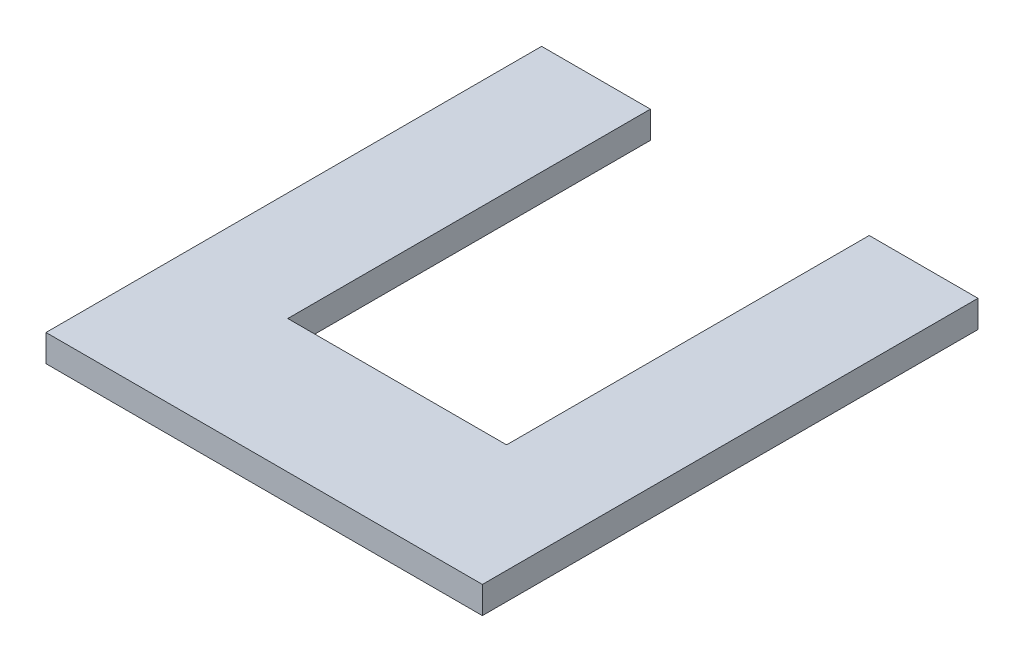
ISO-10303-21;
HEADER;
FILE_DESCRIPTION(('STEP AP214'),'2;1');
FILE_NAME('part.step','',(''),(''),'','','');
FILE_SCHEMA(('AUTOMOTIVE_DESIGN { 1 0 10303 214 1 1 1 1 }'));
ENDSEC;
DATA;
#1=APPLICATION_CONTEXT('core data for automotive mechanical design processes');
#2=APPLICATION_PROTOCOL_DEFINITION('international standard','automotive_design',2000,#1);
#3=PRODUCT_CONTEXT('',#1,'mechanical');
#4=PRODUCT('Part','Part','',(#3));
#5=PRODUCT_RELATED_PRODUCT_CATEGORY('part','',(#4));
#6=PRODUCT_DEFINITION_FORMATION('','',#4);
#7=PRODUCT_DEFINITION_CONTEXT('part definition',#1,'design');
#8=PRODUCT_DEFINITION('design','',#6,#7);
#9=PRODUCT_DEFINITION_SHAPE('','',#8);
#10=(LENGTH_UNIT() NAMED_UNIT(*) SI_UNIT(.MILLI.,.METRE.));
#11=(NAMED_UNIT(*) PLANE_ANGLE_UNIT() SI_UNIT($,.RADIAN.));
#12=(NAMED_UNIT(*) SI_UNIT($,.STERADIAN.) SOLID_ANGLE_UNIT());
#13=UNCERTAINTY_MEASURE_WITH_UNIT(LENGTH_MEASURE(1.E-05),#10,'distance_accuracy_value','');
#14=(GEOMETRIC_REPRESENTATION_CONTEXT(3) GLOBAL_UNCERTAINTY_ASSIGNED_CONTEXT((#13)) GLOBAL_UNIT_ASSIGNED_CONTEXT((#10,
#11,#12)) REPRESENTATION_CONTEXT('',''));
#15=CARTESIAN_POINT('',(0.,0.,0.));
#16=DIRECTION('',(0.,0.,1.));
#17=DIRECTION('',(1.,0.,0.));
#18=AXIS2_PLACEMENT_3D('',#15,#16,#17);
#19=CARTESIAN_POINT('',(0.,5.,-91.567));
#20=DIRECTION('',(0.,0.,1.));
#21=DIRECTION('',(1.,0.,0.));
#22=AXIS2_PLACEMENT_3D('',#19,#20,#21);
#23=PLANE('',#22);
#24=DIRECTION('',(-1.,0.,0.));
#25=VECTOR('',#24,1.);
#26=CARTESIAN_POINT('',(0.,0.,-91.567));
#27=LINE('',#26,#25);
#28=CARTESIAN_POINT('',(80.6273389559778,0.,-91.567));
#29=VERTEX_POINT('',#28);
#30=CARTESIAN_POINT('',(60.5287668480876,0.,-91.567));
#31=VERTEX_POINT('',#30);
#32=EDGE_CURVE('E147',#29,#31,#27,.T.);
#33=ORIENTED_EDGE('',*,*,#32,.T.);
#34=DIRECTION('',(0.,-1.,0.));
#35=VECTOR('',#34,1.);
#36=CARTESIAN_POINT('',(60.5287668480876,5.,-91.567));
#37=LINE('',#36,#35);
#38=CARTESIAN_POINT('',(60.5287668480876,5.,-91.567));
#39=VERTEX_POINT('',#38);
#40=EDGE_CURVE('E11',#39,#31,#37,.T.);
#41=ORIENTED_EDGE('',*,*,#40,.F.);
#42=DIRECTION('',(-1.,0.,0.));
#43=VECTOR('',#42,1.);
#44=CARTESIAN_POINT('',(0.,5.,-91.567));
#45=LINE('',#44,#43);
#46=CARTESIAN_POINT('',(80.6273389559778,5.,-91.567));
#47=VERTEX_POINT('',#46);
#48=EDGE_CURVE('E172',#47,#39,#45,.T.);
#49=ORIENTED_EDGE('',*,*,#48,.F.);
#50=DIRECTION('',(0.,-1.,0.));
#51=VECTOR('',#50,1.);
#52=CARTESIAN_POINT('',(80.6273389559778,5.,-91.567));
#53=LINE('',#52,#51);
#54=EDGE_CURVE('E61',#47,#29,#53,.T.);
#55=ORIENTED_EDGE('',*,*,#54,.T.);
#56=EDGE_LOOP('',(#33,#41,#49,#55));
#57=FACE_BOUND('',#56,.T.);
#58=ADVANCED_FACE('F43',(#57),#23,.F.);
#59=CARTESIAN_POINT('',(60.5287668480876,5.,0.));
#60=DIRECTION('',(1.,0.,0.));
#61=DIRECTION('',(0.,0.,-1.));
#62=AXIS2_PLACEMENT_3D('',#59,#60,#61);
#63=PLANE('',#62);
#64=DIRECTION('',(0.,0.,1.));
#65=VECTOR('',#64,1.);
#66=CARTESIAN_POINT('',(60.5287668480876,0.,0.));
#67=LINE('',#66,#65);
#68=CARTESIAN_POINT('',(60.5287668480876,0.,-24.567));
#69=VERTEX_POINT('',#68);
#70=EDGE_CURVE('E150',#31,#69,#67,.T.);
#71=ORIENTED_EDGE('',*,*,#70,.T.);
#72=DIRECTION('',(0.,-1.,0.));
#73=VECTOR('',#72,1.);
#74=CARTESIAN_POINT('',(60.5287668480876,5.,-24.567));
#75=LINE('',#74,#73);
#76=CARTESIAN_POINT('',(60.5287668480876,5.,-24.567));
#77=VERTEX_POINT('',#76);
#78=EDGE_CURVE('E53',#77,#69,#75,.T.);
#79=ORIENTED_EDGE('',*,*,#78,.F.);
#80=DIRECTION('',(0.,0.,1.));
#81=VECTOR('',#80,1.);
#82=CARTESIAN_POINT('',(60.5287668480876,5.,0.));
#83=LINE('',#82,#81);
#84=EDGE_CURVE('E99',#39,#77,#83,.T.);
#85=ORIENTED_EDGE('',*,*,#84,.F.);
#86=ORIENTED_EDGE('',*,*,#40,.T.);
#87=EDGE_LOOP('',(#71,#79,#85,#86));
#88=FACE_BOUND('',#87,.T.);
#89=ADVANCED_FACE('F45',(#88),#63,.F.);
#90=CARTESIAN_POINT('',(0.,5.,-24.567));
#91=DIRECTION('',(0.,0.,-1.));
#92=DIRECTION('',(-1.,0.,0.));
#93=AXIS2_PLACEMENT_3D('',#90,#91,#92);
#94=PLANE('',#93);
#95=DIRECTION('',(1.,0.,0.));
#96=VECTOR('',#95,1.);
#97=CARTESIAN_POINT('',(0.,0.,-24.567));
#98=LINE('',#97,#96);
#99=CARTESIAN_POINT('',(20.0990596071436,0.,-24.567));
#100=VERTEX_POINT('',#99);
#101=EDGE_CURVE('E155',#100,#69,#98,.T.);
#102=ORIENTED_EDGE('',*,*,#101,.F.);
#103=DIRECTION('',(0.,-1.,0.));
#104=VECTOR('',#103,1.);
#105=CARTESIAN_POINT('',(20.0990596071436,5.,-24.567));
#106=LINE('',#105,#104);
#107=CARTESIAN_POINT('',(20.0990596071436,5.,-24.567));
#108=VERTEX_POINT('',#107);
#109=EDGE_CURVE('E182',#108,#100,#106,.T.);
#110=ORIENTED_EDGE('',*,*,#109,.F.);
#111=DIRECTION('',(1.,0.,0.));
#112=VECTOR('',#111,1.);
#113=CARTESIAN_POINT('',(0.,5.,-24.567));
#114=LINE('',#113,#112);
#115=EDGE_CURVE('E190',#108,#77,#114,.T.);
#116=ORIENTED_EDGE('',*,*,#115,.T.);
#117=ORIENTED_EDGE('',*,*,#78,.T.);
#118=EDGE_LOOP('',(#102,#110,#116,#117));
#119=FACE_BOUND('',#118,.T.);
#120=ADVANCED_FACE('F188',(#119),#94,.T.);
#121=CARTESIAN_POINT('',(20.0990596071436,5.,0.));
#122=DIRECTION('',(1.,0.,0.));
#123=DIRECTION('',(0.,0.,-1.));
#124=AXIS2_PLACEMENT_3D('',#121,#122,#123);
#125=PLANE('',#124);
#126=DIRECTION('',(0.,0.,1.));
#127=VECTOR('',#126,1.);
#128=CARTESIAN_POINT('',(20.0990596071436,0.,0.));
#129=LINE('',#128,#127);
#130=CARTESIAN_POINT('',(20.0990596071436,0.,-91.567));
#131=VERTEX_POINT('',#130);
#132=EDGE_CURVE('E159',#131,#100,#129,.T.);
#133=ORIENTED_EDGE('',*,*,#132,.F.);
#134=DIRECTION('',(0.,-1.,0.));
#135=VECTOR('',#134,1.);
#136=CARTESIAN_POINT('',(20.0990596071436,5.,-91.567));
#137=LINE('',#136,#135);
#138=CARTESIAN_POINT('',(20.0990596071436,5.,-91.567));
#139=VERTEX_POINT('',#138);
#140=EDGE_CURVE('E179',#139,#131,#137,.T.);
#141=ORIENTED_EDGE('',*,*,#140,.F.);
#142=DIRECTION('',(0.,0.,1.));
#143=VECTOR('',#142,1.);
#144=CARTESIAN_POINT('',(20.0990596071436,5.,0.));
#145=LINE('',#144,#143);
#146=EDGE_CURVE('E199',#139,#108,#145,.T.);
#147=ORIENTED_EDGE('',*,*,#146,.T.);
#148=ORIENTED_EDGE('',*,*,#109,.T.);
#149=EDGE_LOOP('',(#133,#141,#147,#148));
#150=FACE_BOUND('',#149,.T.);
#151=ADVANCED_FACE('F197',(#150),#125,.T.);
#152=CARTESIAN_POINT('',(0.,0.,-91.567));
#153=VERTEX_POINT('',#152);
#154=EDGE_CURVE('E151',#131,#153,#27,.T.);
#155=ORIENTED_EDGE('',*,*,#154,.T.);
#156=DIRECTION('',(0.,-1.,0.));
#157=VECTOR('',#156,1.);
#158=CARTESIAN_POINT('',(0.,5.,-91.567));
#159=LINE('',#158,#157);
#160=CARTESIAN_POINT('',(0.,5.,-91.567));
#161=VERTEX_POINT('',#160);
#162=EDGE_CURVE('E137',#161,#153,#159,.T.);
#163=ORIENTED_EDGE('',*,*,#162,.F.);
#164=EDGE_CURVE('E123',#139,#161,#45,.T.);
#165=ORIENTED_EDGE('',*,*,#164,.F.);
#166=ORIENTED_EDGE('',*,*,#140,.T.);
#167=EDGE_LOOP('',(#155,#163,#165,#166));
#168=FACE_BOUND('',#167,.T.);
#169=ADVANCED_FACE('F220',(#168),#23,.F.);
#170=CARTESIAN_POINT('',(0.,5.,0.));
#171=DIRECTION('',(1.,0.,0.));
#172=DIRECTION('',(0.,0.,-1.));
#173=AXIS2_PLACEMENT_3D('',#170,#171,#172);
#174=PLANE('',#173);
#175=DIRECTION('',(0.,0.,1.));
#176=VECTOR('',#175,1.);
#177=CARTESIAN_POINT('',(0.,0.,0.));
#178=LINE('',#177,#176);
#179=CARTESIAN_POINT('',(0.,0.,0.));
#180=VERTEX_POINT('',#179);
#181=EDGE_CURVE('E133',#153,#180,#178,.T.);
#182=ORIENTED_EDGE('',*,*,#181,.T.);
#183=DIRECTION('',(0.,-1.,0.));
#184=VECTOR('',#183,1.);
#185=CARTESIAN_POINT('',(0.,5.,0.));
#186=LINE('',#185,#184);
#187=CARTESIAN_POINT('',(0.,5.,0.));
#188=VERTEX_POINT('',#187);
#189=EDGE_CURVE('E130',#188,#180,#186,.T.);
#190=ORIENTED_EDGE('',*,*,#189,.F.);
#191=DIRECTION('',(0.,0.,1.));
#192=VECTOR('',#191,1.);
#193=CARTESIAN_POINT('',(0.,5.,0.));
#194=LINE('',#193,#192);
#195=EDGE_CURVE('E115',#161,#188,#194,.T.);
#196=ORIENTED_EDGE('',*,*,#195,.F.);
#197=ORIENTED_EDGE('',*,*,#162,.T.);
#198=EDGE_LOOP('',(#182,#190,#196,#197));
#199=FACE_BOUND('',#198,.T.);
#200=ADVANCED_FACE('F131',(#199),#174,.F.);
#201=CARTESIAN_POINT('',(0.,5.,0.));
#202=DIRECTION('',(0.,0.,1.));
#203=DIRECTION('',(1.,0.,0.));
#204=AXIS2_PLACEMENT_3D('',#201,#202,#203);
#205=PLANE('',#204);
#206=DIRECTION('',(-1.,0.,0.));
#207=VECTOR('',#206,1.);
#208=CARTESIAN_POINT('',(0.,0.,0.));
#209=LINE('',#208,#207);
#210=CARTESIAN_POINT('',(80.6273389559778,0.,0.));
#211=VERTEX_POINT('',#210);
#212=EDGE_CURVE('E165',#211,#180,#209,.T.);
#213=ORIENTED_EDGE('',*,*,#212,.F.);
#214=DIRECTION('',(0.,-1.,0.));
#215=VECTOR('',#214,1.);
#216=CARTESIAN_POINT('',(80.6273389559778,5.,0.));
#217=LINE('',#216,#215);
#218=CARTESIAN_POINT('',(80.6273389559778,5.,0.));
#219=VERTEX_POINT('',#218);
#220=EDGE_CURVE('E87',#219,#211,#217,.T.);
#221=ORIENTED_EDGE('',*,*,#220,.F.);
#222=DIRECTION('',(-1.,0.,0.));
#223=VECTOR('',#222,1.);
#224=CARTESIAN_POINT('',(0.,5.,0.));
#225=LINE('',#224,#223);
#226=EDGE_CURVE('E120',#219,#188,#225,.T.);
#227=ORIENTED_EDGE('',*,*,#226,.T.);
#228=ORIENTED_EDGE('',*,*,#189,.T.);
#229=EDGE_LOOP('',(#213,#221,#227,#228));
#230=FACE_BOUND('',#229,.T.);
#231=ADVANCED_FACE('F139',(#230),#205,.T.);
#232=CARTESIAN_POINT('',(80.6273389559778,5.,0.));
#233=DIRECTION('',(1.,0.,0.));
#234=DIRECTION('',(0.,0.,-1.));
#235=AXIS2_PLACEMENT_3D('',#232,#233,#234);
#236=PLANE('',#235);
#237=DIRECTION('',(0.,0.,1.));
#238=VECTOR('',#237,1.);
#239=CARTESIAN_POINT('',(80.6273389559778,0.,0.));
#240=LINE('',#239,#238);
#241=EDGE_CURVE('E168',#29,#211,#240,.T.);
#242=ORIENTED_EDGE('',*,*,#241,.F.);
#243=ORIENTED_EDGE('',*,*,#54,.F.);
#244=DIRECTION('',(0.,0.,1.));
#245=VECTOR('',#244,1.);
#246=CARTESIAN_POINT('',(80.6273389559778,5.,0.));
#247=LINE('',#246,#245);
#248=EDGE_CURVE('E141',#47,#219,#247,.T.);
#249=ORIENTED_EDGE('',*,*,#248,.T.);
#250=ORIENTED_EDGE('',*,*,#220,.T.);
#251=EDGE_LOOP('',(#242,#243,#249,#250));
#252=FACE_BOUND('',#251,.T.);
#253=ADVANCED_FACE('F208',(#252),#236,.T.);
#254=CARTESIAN_POINT('',(0.,5.,0.));
#255=DIRECTION('',(0.,1.,0.));
#256=DIRECTION('',(0.,0.,1.));
#257=AXIS2_PLACEMENT_3D('',#254,#255,#256);
#258=PLANE('',#257);
#259=ORIENTED_EDGE('',*,*,#48,.T.);
#260=ORIENTED_EDGE('',*,*,#84,.T.);
#261=ORIENTED_EDGE('',*,*,#115,.F.);
#262=ORIENTED_EDGE('',*,*,#146,.F.);
#263=ORIENTED_EDGE('',*,*,#164,.T.);
#264=ORIENTED_EDGE('',*,*,#195,.T.);
#265=ORIENTED_EDGE('',*,*,#226,.F.);
#266=ORIENTED_EDGE('',*,*,#248,.F.);
#267=EDGE_LOOP('',(#259,#260,#261,#262,#263,#264,#265,#266));
#268=FACE_BOUND('',#267,.T.);
#269=ADVANCED_FACE('F117',(#268),#258,.T.);
#270=CARTESIAN_POINT('',(0.,0.,0.));
#271=DIRECTION('',(0.,1.,0.));
#272=DIRECTION('',(0.,0.,1.));
#273=AXIS2_PLACEMENT_3D('',#270,#271,#272);
#274=PLANE('',#273);
#275=ORIENTED_EDGE('',*,*,#32,.F.);
#276=ORIENTED_EDGE('',*,*,#241,.T.);
#277=ORIENTED_EDGE('',*,*,#212,.T.);
#278=ORIENTED_EDGE('',*,*,#181,.F.);
#279=ORIENTED_EDGE('',*,*,#154,.F.);
#280=ORIENTED_EDGE('',*,*,#132,.T.);
#281=ORIENTED_EDGE('',*,*,#101,.T.);
#282=ORIENTED_EDGE('',*,*,#70,.F.);
#283=EDGE_LOOP('',(#275,#276,#277,#278,#279,#280,#281,#282));
#284=FACE_BOUND('',#283,.T.);
#285=ADVANCED_FACE('F193',(#284),#274,.F.);
#286=CLOSED_SHELL('',(#58,#89,#120,#151,#169,#200,#231,#253,#269,#285));
#287=MANIFOLD_SOLID_BREP('B2',#286);
#288=ADVANCED_BREP_SHAPE_REPRESENTATION('',(#18,#287),#14);
#289=SHAPE_DEFINITION_REPRESENTATION(#9,#288);
ENDSEC;
END-ISO-10303-21;
